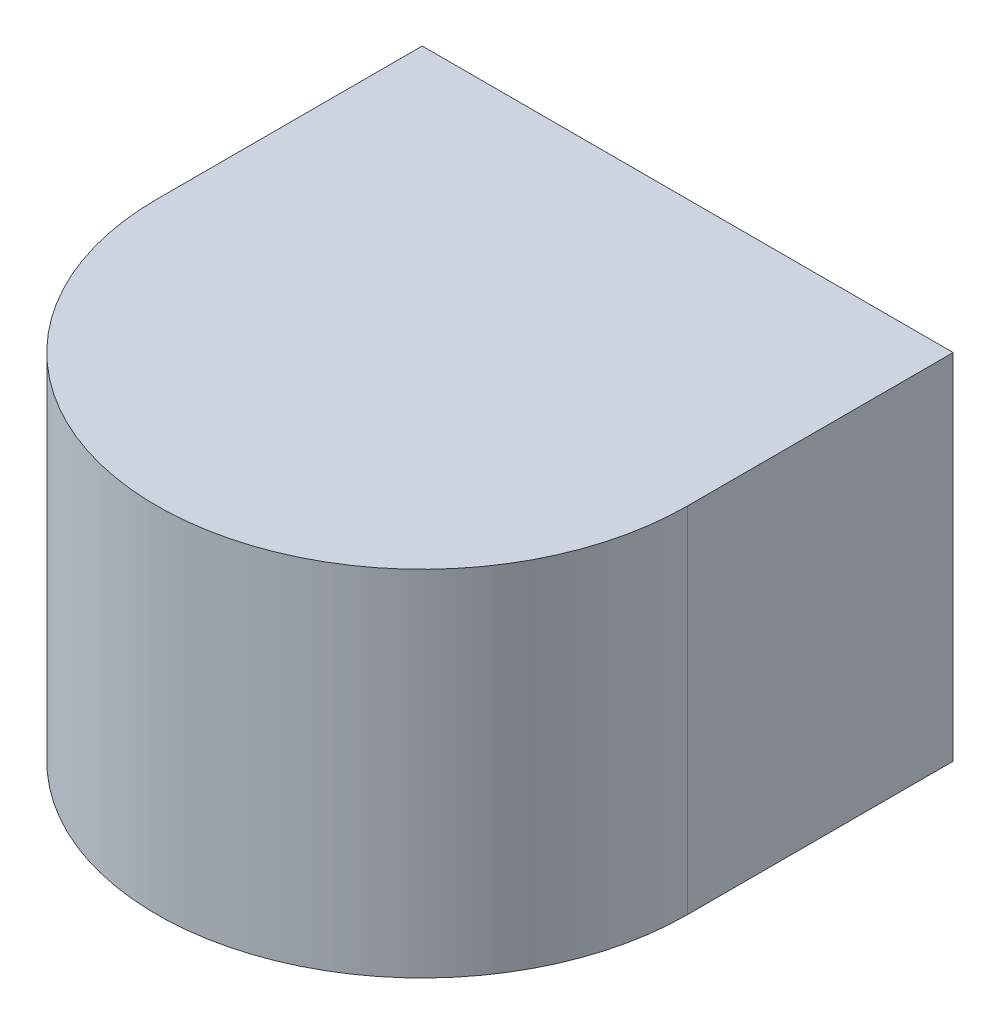
ISO-10303-21;
HEADER;
FILE_DESCRIPTION(('STEP AP214'),'2;1');
FILE_NAME('part.step','',(''),(''),'','','');
FILE_SCHEMA(('AUTOMOTIVE_DESIGN { 1 0 10303 214 1 1 1 1 }'));
ENDSEC;
DATA;
#1=APPLICATION_CONTEXT('core data for automotive mechanical design processes');
#2=APPLICATION_PROTOCOL_DEFINITION('international standard','automotive_design',2000,#1);
#3=PRODUCT_CONTEXT('',#1,'mechanical');
#4=PRODUCT('Part','Part','',(#3));
#5=PRODUCT_RELATED_PRODUCT_CATEGORY('part','',(#4));
#6=PRODUCT_DEFINITION_FORMATION('','',#4);
#7=PRODUCT_DEFINITION_CONTEXT('part definition',#1,'design');
#8=PRODUCT_DEFINITION('design','',#6,#7);
#9=PRODUCT_DEFINITION_SHAPE('','',#8);
#10=(LENGTH_UNIT() NAMED_UNIT(*) SI_UNIT(.MILLI.,.METRE.));
#11=(NAMED_UNIT(*) PLANE_ANGLE_UNIT() SI_UNIT($,.RADIAN.));
#12=(NAMED_UNIT(*) SI_UNIT($,.STERADIAN.) SOLID_ANGLE_UNIT());
#13=UNCERTAINTY_MEASURE_WITH_UNIT(LENGTH_MEASURE(1.E-05),#10,'distance_accuracy_value','');
#14=(GEOMETRIC_REPRESENTATION_CONTEXT(3) GLOBAL_UNCERTAINTY_ASSIGNED_CONTEXT((#13)) GLOBAL_UNIT_ASSIGNED_CONTEXT((#10,
#11,#12)) REPRESENTATION_CONTEXT('',''));
#15=CARTESIAN_POINT('',(0.,0.,0.));
#16=DIRECTION('',(0.,0.,1.));
#17=DIRECTION('',(1.,0.,0.));
#18=AXIS2_PLACEMENT_3D('',#15,#16,#17);
#19=CARTESIAN_POINT('',(7.0762,3.1756,-2.628));
#20=DIRECTION('',(0.,-1.,0.));
#21=DIRECTION('',(0.,0.,-1.));
#22=AXIS2_PLACEMENT_3D('',#19,#20,#21);
#23=CYLINDRICAL_SURFACE('',#22,0.15);
#24=CARTESIAN_POINT('',(7.0762,2.9756,-2.628));
#25=DIRECTION('',(0.,1.,0.));
#26=DIRECTION('',(0.,0.,1.));
#27=AXIS2_PLACEMENT_3D('',#24,#25,#26);
#28=CIRCLE('',#27,0.15);
#29=CARTESIAN_POINT('',(6.9262,2.9756,-2.628));
#30=VERTEX_POINT('',#29);
#31=CARTESIAN_POINT('',(7.2262,2.9756,-2.628));
#32=VERTEX_POINT('',#31);
#33=EDGE_CURVE('E11',#30,#32,#28,.T.);
#34=ORIENTED_EDGE('',*,*,#33,.T.);
#35=DIRECTION('',(0.,-1.,0.));
#36=VECTOR('',#35,1.);
#37=CARTESIAN_POINT('',(7.2262,3.1756,-2.628));
#38=LINE('',#37,#36);
#39=CARTESIAN_POINT('',(7.2262,3.1756,-2.628));
#40=VERTEX_POINT('',#39);
#41=EDGE_CURVE('E24',#40,#32,#38,.T.);
#42=ORIENTED_EDGE('',*,*,#41,.F.);
#43=CARTESIAN_POINT('',(7.0762,3.1756,-2.628));
#44=DIRECTION('',(0.,1.,0.));
#45=DIRECTION('',(0.,0.,1.));
#46=AXIS2_PLACEMENT_3D('',#43,#44,#45);
#47=CIRCLE('',#46,0.15);
#48=CARTESIAN_POINT('',(6.9262,3.1756,-2.628));
#49=VERTEX_POINT('',#48);
#50=EDGE_CURVE('E88',#49,#40,#47,.T.);
#51=ORIENTED_EDGE('',*,*,#50,.F.);
#52=DIRECTION('',(0.,-1.,0.));
#53=VECTOR('',#52,1.);
#54=CARTESIAN_POINT('',(6.9262,3.1756,-2.628));
#55=LINE('',#54,#53);
#56=EDGE_CURVE('E77',#49,#30,#55,.T.);
#57=ORIENTED_EDGE('',*,*,#56,.T.);
#58=EDGE_LOOP('',(#34,#42,#51,#57));
#59=FACE_BOUND('',#58,.T.);
#60=ADVANCED_FACE('F17',(#59),#23,.T.);
#61=CARTESIAN_POINT('',(7.2262,3.1756,-2.778));
#62=DIRECTION('',(-1.,0.,0.));
#63=DIRECTION('',(0.,0.,1.));
#64=AXIS2_PLACEMENT_3D('',#61,#62,#63);
#65=PLANE('',#64);
#66=DIRECTION('',(0.,0.,-1.));
#67=VECTOR('',#66,1.);
#68=CARTESIAN_POINT('',(7.2262,2.9756,-2.778));
#69=LINE('',#68,#67);
#70=CARTESIAN_POINT('',(7.2262,2.9756,-2.778));
#71=VERTEX_POINT('',#70);
#72=EDGE_CURVE('E85',#32,#71,#69,.T.);
#73=ORIENTED_EDGE('',*,*,#72,.T.);
#74=DIRECTION('',(0.,-1.,0.));
#75=VECTOR('',#74,1.);
#76=CARTESIAN_POINT('',(7.2262,3.1756,-2.778));
#77=LINE('',#76,#75);
#78=CARTESIAN_POINT('',(7.2262,3.1756,-2.778));
#79=VERTEX_POINT('',#78);
#80=EDGE_CURVE('E83',#79,#71,#77,.T.);
#81=ORIENTED_EDGE('',*,*,#80,.F.);
#82=DIRECTION('',(0.,0.,-1.));
#83=VECTOR('',#82,1.);
#84=CARTESIAN_POINT('',(7.2262,3.1756,-2.778));
#85=LINE('',#84,#83);
#86=EDGE_CURVE('E72',#40,#79,#85,.T.);
#87=ORIENTED_EDGE('',*,*,#86,.F.);
#88=ORIENTED_EDGE('',*,*,#41,.T.);
#89=EDGE_LOOP('',(#73,#81,#87,#88));
#90=FACE_BOUND('',#89,.T.);
#91=ADVANCED_FACE('F90',(#90),#65,.F.);
#92=CARTESIAN_POINT('',(6.9262,3.1756,-2.778));
#93=DIRECTION('',(0.,0.,1.));
#94=DIRECTION('',(1.,0.,0.));
#95=AXIS2_PLACEMENT_3D('',#92,#93,#94);
#96=PLANE('',#95);
#97=DIRECTION('',(-1.,0.,0.));
#98=VECTOR('',#97,1.);
#99=CARTESIAN_POINT('',(6.9262,2.9756,-2.778));
#100=LINE('',#99,#98);
#101=CARTESIAN_POINT('',(6.9262,2.9756,-2.778));
#102=VERTEX_POINT('',#101);
#103=EDGE_CURVE('E60',#71,#102,#100,.T.);
#104=ORIENTED_EDGE('',*,*,#103,.T.);
#105=DIRECTION('',(0.,-1.,0.));
#106=VECTOR('',#105,1.);
#107=CARTESIAN_POINT('',(6.9262,3.1756,-2.778));
#108=LINE('',#107,#106);
#109=CARTESIAN_POINT('',(6.9262,3.1756,-2.778));
#110=VERTEX_POINT('',#109);
#111=EDGE_CURVE('E54',#110,#102,#108,.T.);
#112=ORIENTED_EDGE('',*,*,#111,.F.);
#113=DIRECTION('',(-1.,0.,0.));
#114=VECTOR('',#113,1.);
#115=CARTESIAN_POINT('',(6.9262,3.1756,-2.778));
#116=LINE('',#115,#114);
#117=EDGE_CURVE('E58',#79,#110,#116,.T.);
#118=ORIENTED_EDGE('',*,*,#117,.F.);
#119=ORIENTED_EDGE('',*,*,#80,.T.);
#120=EDGE_LOOP('',(#104,#112,#118,#119));
#121=FACE_BOUND('',#120,.T.);
#122=ADVANCED_FACE('F56',(#121),#96,.F.);
#123=CARTESIAN_POINT('',(6.9262,3.1756,-2.628));
#124=DIRECTION('',(1.,0.,0.));
#125=DIRECTION('',(0.,0.,-1.));
#126=AXIS2_PLACEMENT_3D('',#123,#124,#125);
#127=PLANE('',#126);
#128=DIRECTION('',(0.,0.,1.));
#129=VECTOR('',#128,1.);
#130=CARTESIAN_POINT('',(6.9262,2.9756,-2.628));
#131=LINE('',#130,#129);
#132=EDGE_CURVE('E73',#102,#30,#131,.T.);
#133=ORIENTED_EDGE('',*,*,#132,.T.);
#134=ORIENTED_EDGE('',*,*,#56,.F.);
#135=DIRECTION('',(0.,0.,1.));
#136=VECTOR('',#135,1.);
#137=CARTESIAN_POINT('',(6.9262,3.1756,-2.628));
#138=LINE('',#137,#136);
#139=EDGE_CURVE('E70',#110,#49,#138,.T.);
#140=ORIENTED_EDGE('',*,*,#139,.F.);
#141=ORIENTED_EDGE('',*,*,#111,.T.);
#142=EDGE_LOOP('',(#133,#134,#140,#141));
#143=FACE_BOUND('',#142,.T.);
#144=ADVANCED_FACE('F76',(#143),#127,.F.);
#145=CARTESIAN_POINT('',(7.0762,3.1756,-2.628));
#146=DIRECTION('',(0.,1.,0.));
#147=DIRECTION('',(0.,0.,1.));
#148=AXIS2_PLACEMENT_3D('',#145,#146,#147);
#149=PLANE('',#148);
#150=ORIENTED_EDGE('',*,*,#50,.T.);
#151=ORIENTED_EDGE('',*,*,#86,.T.);
#152=ORIENTED_EDGE('',*,*,#117,.T.);
#153=ORIENTED_EDGE('',*,*,#139,.T.);
#154=EDGE_LOOP('',(#150,#151,#152,#153));
#155=FACE_BOUND('',#154,.T.);
#156=ADVANCED_FACE('F69',(#155),#149,.T.);
#157=CARTESIAN_POINT('',(7.0762,2.9756,-2.628));
#158=DIRECTION('',(0.,1.,0.));
#159=DIRECTION('',(0.,0.,1.));
#160=AXIS2_PLACEMENT_3D('',#157,#158,#159);
#161=PLANE('',#160);
#162=ORIENTED_EDGE('',*,*,#33,.F.);
#163=ORIENTED_EDGE('',*,*,#132,.F.);
#164=ORIENTED_EDGE('',*,*,#103,.F.);
#165=ORIENTED_EDGE('',*,*,#72,.F.);
#166=EDGE_LOOP('',(#162,#163,#164,#165));
#167=FACE_BOUND('',#166,.T.);
#168=ADVANCED_FACE('F91',(#167),#161,.F.);
#169=CLOSED_SHELL('',(#60,#91,#122,#144,#156,#168));
#170=MANIFOLD_SOLID_BREP('B1',#169);
#171=ADVANCED_BREP_SHAPE_REPRESENTATION('',(#18,#170),#14);
#172=SHAPE_DEFINITION_REPRESENTATION(#9,#171);
ENDSEC;
END-ISO-10303-21;
